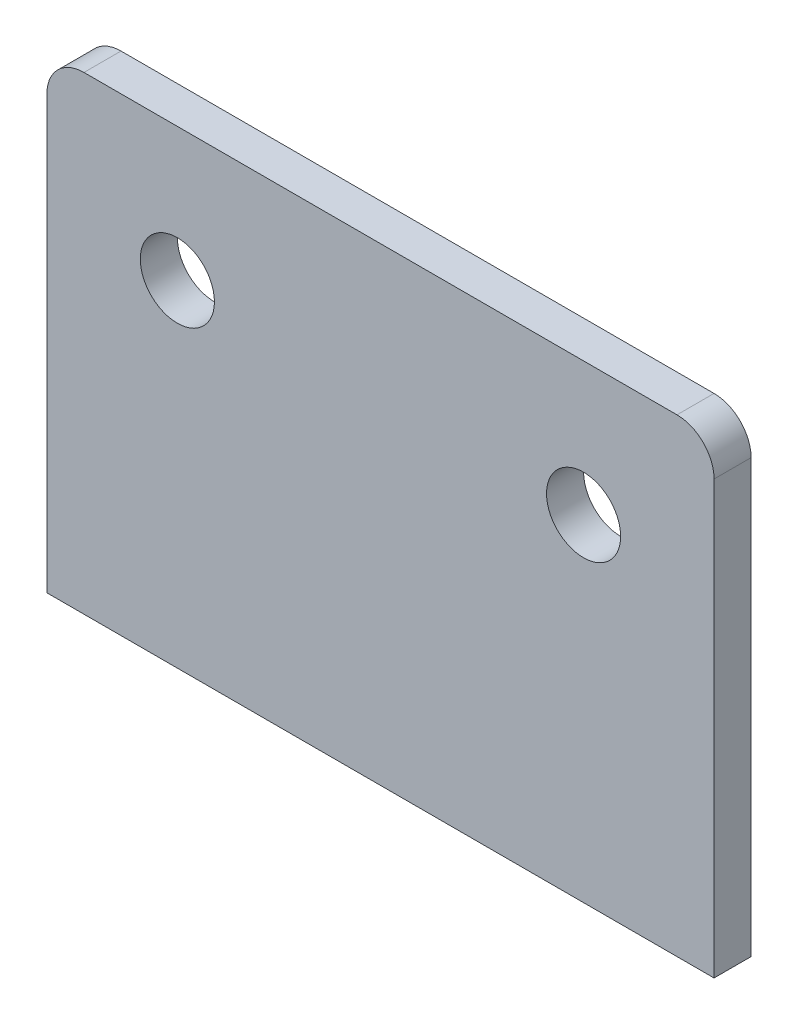
ISO-10303-21;
HEADER;
FILE_DESCRIPTION(('STEP AP214'),'2;1');
FILE_NAME('part.step','',(''),(''),'','','');
FILE_SCHEMA(('AUTOMOTIVE_DESIGN { 1 0 10303 214 1 1 1 1 }'));
ENDSEC;
DATA;
#1=APPLICATION_CONTEXT('core data for automotive mechanical design processes');
#2=APPLICATION_PROTOCOL_DEFINITION('international standard','automotive_design',2000,#1);
#3=PRODUCT_CONTEXT('',#1,'mechanical');
#4=PRODUCT('Part','Part','',(#3));
#5=PRODUCT_RELATED_PRODUCT_CATEGORY('part','',(#4));
#6=PRODUCT_DEFINITION_FORMATION('','',#4);
#7=PRODUCT_DEFINITION_CONTEXT('part definition',#1,'design');
#8=PRODUCT_DEFINITION('design','',#6,#7);
#9=PRODUCT_DEFINITION_SHAPE('','',#8);
#10=(LENGTH_UNIT() NAMED_UNIT(*) SI_UNIT(.MILLI.,.METRE.));
#11=(NAMED_UNIT(*) PLANE_ANGLE_UNIT() SI_UNIT($,.RADIAN.));
#12=(NAMED_UNIT(*) SI_UNIT($,.STERADIAN.) SOLID_ANGLE_UNIT());
#13=UNCERTAINTY_MEASURE_WITH_UNIT(LENGTH_MEASURE(1.E-05),#10,'distance_accuracy_value','');
#14=(GEOMETRIC_REPRESENTATION_CONTEXT(3) GLOBAL_UNCERTAINTY_ASSIGNED_CONTEXT((#13)) GLOBAL_UNIT_ASSIGNED_CONTEXT((#10,
#11,#12)) REPRESENTATION_CONTEXT('',''));
#15=CARTESIAN_POINT('',(0.,0.,0.));
#16=DIRECTION('',(0.,0.,1.));
#17=DIRECTION('',(1.,0.,0.));
#18=AXIS2_PLACEMENT_3D('',#15,#16,#17);
#19=CARTESIAN_POINT('',(-28.3289512231324,3.07077373787596,-3.175));
#20=DIRECTION('',(-1.,0.,0.));
#21=DIRECTION('',(0.,-1.,0.));
#22=AXIS2_PLACEMENT_3D('',#19,#20,#21);
#23=PLANE('',#22);
#24=DIRECTION('',(0.,0.,-1.));
#25=VECTOR('',#24,1.);
#26=CARTESIAN_POINT('',(-28.3289512231324,-33.946696309652,1.905));
#27=LINE('',#26,#25);
#28=CARTESIAN_POINT('',(-28.3289512231324,-33.946696309652,0.));
#29=VERTEX_POINT('',#28);
#30=CARTESIAN_POINT('',(-28.3289512231324,-33.946696309652,-3.175));
#31=VERTEX_POINT('',#30);
#32=EDGE_CURVE('E96',#29,#31,#27,.T.);
#33=ORIENTED_EDGE('',*,*,#32,.F.);
#34=DIRECTION('',(0.,-1.,0.));
#35=VECTOR('',#34,1.);
#36=CARTESIAN_POINT('',(-28.3289512231324,3.07077373787596,0.));
#37=LINE('',#36,#35);
#38=CARTESIAN_POINT('',(-28.3289512231324,3.07077373787596,0.));
#39=VERTEX_POINT('',#38);
#40=EDGE_CURVE('E106',#39,#29,#37,.T.);
#41=ORIENTED_EDGE('',*,*,#40,.F.);
#42=DIRECTION('',(0.,0.,1.));
#43=VECTOR('',#42,1.);
#44=CARTESIAN_POINT('',(-28.3289512231324,3.07077373787596,-3.175));
#45=LINE('',#44,#43);
#46=CARTESIAN_POINT('',(-28.3289512231324,3.07077373787596,-3.175));
#47=VERTEX_POINT('',#46);
#48=EDGE_CURVE('E43',#47,#39,#45,.T.);
#49=ORIENTED_EDGE('',*,*,#48,.F.);
#50=DIRECTION('',(0.,-1.,0.));
#51=VECTOR('',#50,1.);
#52=CARTESIAN_POINT('',(-28.3289512231324,-34.9224567040588,-3.175));
#53=LINE('',#52,#51);
#54=EDGE_CURVE('E58',#47,#31,#53,.T.);
#55=ORIENTED_EDGE('',*,*,#54,.T.);
#56=EDGE_LOOP('',(#33,#41,#49,#55));
#57=FACE_BOUND('',#56,.T.);
#58=ADVANCED_FACE('F35',(#57),#23,.T.);
#59=CARTESIAN_POINT('',(-25.1539512231324,3.07077373787597,-3.175));
#60=DIRECTION('',(0.,0.,1.));
#61=DIRECTION('',(1.,0.,0.));
#62=AXIS2_PLACEMENT_3D('',#59,#60,#61);
#63=CYLINDRICAL_SURFACE('',#62,3.175);
#64=CARTESIAN_POINT('',(-25.1539512231324,3.07077373787597,0.));
#65=DIRECTION('',(0.,0.,1.));
#66=DIRECTION('',(1.,0.,0.));
#67=AXIS2_PLACEMENT_3D('',#64,#65,#66);
#68=CIRCLE('',#67,3.175);
#69=CARTESIAN_POINT('',(-25.1539512231324,6.24577373787597,0.));
#70=VERTEX_POINT('',#69);
#71=EDGE_CURVE('E110',#70,#39,#68,.T.);
#72=ORIENTED_EDGE('',*,*,#71,.F.);
#73=DIRECTION('',(0.,0.,1.));
#74=VECTOR('',#73,1.);
#75=CARTESIAN_POINT('',(-25.1539512231324,6.24577373787597,-3.175));
#76=LINE('',#75,#74);
#77=CARTESIAN_POINT('',(-25.1539512231324,6.24577373787597,-3.175));
#78=VERTEX_POINT('',#77);
#79=EDGE_CURVE('E135',#78,#70,#76,.T.);
#80=ORIENTED_EDGE('',*,*,#79,.F.);
#81=CARTESIAN_POINT('',(-25.1539512231324,3.07077373787597,-3.175));
#82=DIRECTION('',(0.,0.,1.));
#83=DIRECTION('',(1.,0.,0.));
#84=AXIS2_PLACEMENT_3D('',#81,#82,#83);
#85=CIRCLE('',#84,3.175);
#86=EDGE_CURVE('E121',#78,#47,#85,.T.);
#87=ORIENTED_EDGE('',*,*,#86,.T.);
#88=ORIENTED_EDGE('',*,*,#48,.T.);
#89=EDGE_LOOP('',(#72,#80,#87,#88));
#90=FACE_BOUND('',#89,.T.);
#91=ADVANCED_FACE('F146',(#90),#63,.T.);
#92=CARTESIAN_POINT('',(-25.1539512231324,6.24577373787597,-3.175));
#93=DIRECTION('',(0.,1.,0.));
#94=DIRECTION('',(0.,0.,1.));
#95=AXIS2_PLACEMENT_3D('',#92,#93,#94);
#96=PLANE('',#95);
#97=DIRECTION('',(-1.,0.,0.));
#98=VECTOR('',#97,1.);
#99=CARTESIAN_POINT('',(-25.1539512231324,6.24577373787597,0.));
#100=LINE('',#99,#98);
#101=CARTESIAN_POINT('',(25.6460487768676,6.24577373787597,0.));
#102=VERTEX_POINT('',#101);
#103=EDGE_CURVE('E130',#102,#70,#100,.T.);
#104=ORIENTED_EDGE('',*,*,#103,.F.);
#105=DIRECTION('',(0.,0.,1.));
#106=VECTOR('',#105,1.);
#107=CARTESIAN_POINT('',(25.6460487768676,6.24577373787597,-3.175));
#108=LINE('',#107,#106);
#109=CARTESIAN_POINT('',(25.6460487768676,6.24577373787597,-3.175));
#110=VERTEX_POINT('',#109);
#111=EDGE_CURVE('E137',#110,#102,#108,.T.);
#112=ORIENTED_EDGE('',*,*,#111,.F.);
#113=DIRECTION('',(-1.,0.,0.));
#114=VECTOR('',#113,1.);
#115=CARTESIAN_POINT('',(-25.1539512231324,6.24577373787597,-3.175));
#116=LINE('',#115,#114);
#117=EDGE_CURVE('E118',#110,#78,#116,.T.);
#118=ORIENTED_EDGE('',*,*,#117,.T.);
#119=ORIENTED_EDGE('',*,*,#79,.T.);
#120=EDGE_LOOP('',(#104,#112,#118,#119));
#121=FACE_BOUND('',#120,.T.);
#122=ADVANCED_FACE('F149',(#121),#96,.T.);
#123=CARTESIAN_POINT('',(25.6460487768676,3.07077373787597,-3.175));
#124=DIRECTION('',(0.,0.,1.));
#125=DIRECTION('',(1.,0.,0.));
#126=AXIS2_PLACEMENT_3D('',#123,#124,#125);
#127=CYLINDRICAL_SURFACE('',#126,3.175);
#128=CARTESIAN_POINT('',(25.6460487768676,3.07077373787597,0.));
#129=DIRECTION('',(0.,0.,1.));
#130=DIRECTION('',(-1.,0.,0.));
#131=AXIS2_PLACEMENT_3D('',#128,#129,#130);
#132=CIRCLE('',#131,3.175);
#133=CARTESIAN_POINT('',(28.8210487768676,3.07077373787597,0.));
#134=VERTEX_POINT('',#133);
#135=EDGE_CURVE('E126',#134,#102,#132,.T.);
#136=ORIENTED_EDGE('',*,*,#135,.F.);
#137=DIRECTION('',(0.,0.,1.));
#138=VECTOR('',#137,1.);
#139=CARTESIAN_POINT('',(28.8210487768676,3.07077373787597,-3.175));
#140=LINE('',#139,#138);
#141=CARTESIAN_POINT('',(28.8210487768676,3.07077373787597,-3.175));
#142=VERTEX_POINT('',#141);
#143=EDGE_CURVE('E123',#142,#134,#140,.T.);
#144=ORIENTED_EDGE('',*,*,#143,.F.);
#145=CARTESIAN_POINT('',(25.6460487768676,3.07077373787597,-3.175));
#146=DIRECTION('',(0.,0.,1.));
#147=DIRECTION('',(-1.,0.,0.));
#148=AXIS2_PLACEMENT_3D('',#145,#146,#147);
#149=CIRCLE('',#148,3.175);
#150=EDGE_CURVE('E108',#142,#110,#149,.T.);
#151=ORIENTED_EDGE('',*,*,#150,.T.);
#152=ORIENTED_EDGE('',*,*,#111,.T.);
#153=EDGE_LOOP('',(#136,#144,#151,#152));
#154=FACE_BOUND('',#153,.T.);
#155=ADVANCED_FACE('F141',(#154),#127,.T.);
#156=CARTESIAN_POINT('',(28.8210487768676,-34.9224567040588,-3.175));
#157=DIRECTION('',(1.,0.,0.));
#158=DIRECTION('',(0.,0.,-1.));
#159=AXIS2_PLACEMENT_3D('',#156,#157,#158);
#160=PLANE('',#159);
#161=DIRECTION('',(0.,0.,-1.));
#162=VECTOR('',#161,1.);
#163=CARTESIAN_POINT('',(28.8210487768676,-33.946696309652,1.905));
#164=LINE('',#163,#162);
#165=CARTESIAN_POINT('',(28.8210487768676,-33.946696309652,0.));
#166=VERTEX_POINT('',#165);
#167=CARTESIAN_POINT('',(28.8210487768676,-33.946696309652,-3.175));
#168=VERTEX_POINT('',#167);
#169=EDGE_CURVE('E49',#166,#168,#164,.T.);
#170=ORIENTED_EDGE('',*,*,#169,.T.);
#171=DIRECTION('',(0.,1.,0.));
#172=VECTOR('',#171,1.);
#173=CARTESIAN_POINT('',(28.8210487768676,-34.9224567040588,-3.175));
#174=LINE('',#173,#172);
#175=EDGE_CURVE('E86',#168,#142,#174,.T.);
#176=ORIENTED_EDGE('',*,*,#175,.T.);
#177=ORIENTED_EDGE('',*,*,#143,.T.);
#178=DIRECTION('',(0.,1.,0.));
#179=VECTOR('',#178,1.);
#180=CARTESIAN_POINT('',(28.8210487768676,-34.9224567040588,0.));
#181=LINE('',#180,#179);
#182=EDGE_CURVE('E124',#166,#134,#181,.T.);
#183=ORIENTED_EDGE('',*,*,#182,.F.);
#184=EDGE_LOOP('',(#170,#176,#177,#183));
#185=FACE_BOUND('',#184,.T.);
#186=ADVANCED_FACE('F37',(#185),#160,.T.);
#187=CARTESIAN_POINT('',(-25.1539512231324,-57.1474567040588,-3.175));
#188=DIRECTION('',(0.,0.,1.));
#189=DIRECTION('',(1.,0.,0.));
#190=AXIS2_PLACEMENT_3D('',#187,#188,#189);
#191=PLANE('',#190);
#192=CARTESIAN_POINT('',(-17.1529512231324,-5.18422626212403,-3.175));
#193=DIRECTION('',(0.,0.,1.));
#194=DIRECTION('',(1.,0.,0.));
#195=AXIS2_PLACEMENT_3D('',#192,#193,#194);
#196=CIRCLE('',#195,3.175);
#197=CARTESIAN_POINT('',(-13.9779512231324,-5.18422626212403,-3.175));
#198=VERTEX_POINT('',#197);
#199=EDGE_CURVE('E127',#198,#198,#196,.T.);
#200=ORIENTED_EDGE('',*,*,#199,.T.);
#201=EDGE_LOOP('',(#200));
#202=FACE_BOUND('',#201,.T.);
#203=CARTESIAN_POINT('',(17.6450487768676,-5.18422626212403,-3.175));
#204=DIRECTION('',(0.,0.,1.));
#205=DIRECTION('',(-1.,0.,0.));
#206=AXIS2_PLACEMENT_3D('',#203,#204,#205);
#207=CIRCLE('',#206,3.175);
#208=CARTESIAN_POINT('',(14.4700487768676,-5.18422626212403,-3.175));
#209=VERTEX_POINT('',#208);
#210=EDGE_CURVE('E245',#209,#209,#207,.T.);
#211=ORIENTED_EDGE('',*,*,#210,.T.);
#212=EDGE_LOOP('',(#211));
#213=FACE_BOUND('',#212,.T.);
#214=ORIENTED_EDGE('',*,*,#175,.F.);
#215=DIRECTION('',(1.,0.,0.));
#216=VECTOR('',#215,1.);
#217=CARTESIAN_POINT('',(28.8210487768676,-33.946696309652,-3.175));
#218=LINE('',#217,#216);
#219=EDGE_CURVE('E98',#31,#168,#218,.T.);
#220=ORIENTED_EDGE('',*,*,#219,.F.);
#221=ORIENTED_EDGE('',*,*,#54,.F.);
#222=ORIENTED_EDGE('',*,*,#86,.F.);
#223=ORIENTED_EDGE('',*,*,#117,.F.);
#224=ORIENTED_EDGE('',*,*,#150,.F.);
#225=EDGE_LOOP('',(#214,#220,#221,#222,#223,#224));
#226=FACE_BOUND('',#225,.T.);
#227=ADVANCED_FACE('F103',(#202,#213,#226),#191,.F.);
#228=CARTESIAN_POINT('',(-25.1539512231324,-57.1474567040588,0.));
#229=DIRECTION('',(0.,0.,1.));
#230=DIRECTION('',(1.,0.,0.));
#231=AXIS2_PLACEMENT_3D('',#228,#229,#230);
#232=PLANE('',#231);
#233=DIRECTION('',(-1.,0.,0.));
#234=VECTOR('',#233,1.);
#235=CARTESIAN_POINT('',(-25.1539512231324,-33.946696309652,0.));
#236=LINE('',#235,#234);
#237=EDGE_CURVE('E11',#166,#29,#236,.T.);
#238=ORIENTED_EDGE('',*,*,#237,.F.);
#239=ORIENTED_EDGE('',*,*,#182,.T.);
#240=ORIENTED_EDGE('',*,*,#135,.T.);
#241=ORIENTED_EDGE('',*,*,#103,.T.);
#242=ORIENTED_EDGE('',*,*,#71,.T.);
#243=ORIENTED_EDGE('',*,*,#40,.T.);
#244=EDGE_LOOP('',(#238,#239,#240,#241,#242,#243));
#245=FACE_BOUND('',#244,.T.);
#246=CARTESIAN_POINT('',(-17.1529512231324,-5.18422626212403,0.));
#247=DIRECTION('',(0.,0.,1.));
#248=DIRECTION('',(1.,0.,0.));
#249=AXIS2_PLACEMENT_3D('',#246,#247,#248);
#250=CIRCLE('',#249,3.175);
#251=CARTESIAN_POINT('',(-13.9779512231324,-5.18422626212403,0.));
#252=VERTEX_POINT('',#251);
#253=EDGE_CURVE('E244',#252,#252,#250,.T.);
#254=ORIENTED_EDGE('',*,*,#253,.F.);
#255=EDGE_LOOP('',(#254));
#256=FACE_BOUND('',#255,.T.);
#257=CARTESIAN_POINT('',(17.6450487768676,-5.18422626212403,0.));
#258=DIRECTION('',(0.,0.,1.));
#259=DIRECTION('',(-1.,0.,0.));
#260=AXIS2_PLACEMENT_3D('',#257,#258,#259);
#261=CIRCLE('',#260,3.175);
#262=CARTESIAN_POINT('',(14.4700487768676,-5.18422626212403,0.));
#263=VERTEX_POINT('',#262);
#264=EDGE_CURVE('E113',#263,#263,#261,.T.);
#265=ORIENTED_EDGE('',*,*,#264,.F.);
#266=EDGE_LOOP('',(#265));
#267=FACE_BOUND('',#266,.T.);
#268=ADVANCED_FACE('F144',(#245,#256,#267),#232,.T.);
#269=CARTESIAN_POINT('',(17.6450487768676,-5.18422626212403,-3.175));
#270=DIRECTION('',(0.,0.,1.));
#271=DIRECTION('',(1.,0.,0.));
#272=AXIS2_PLACEMENT_3D('',#269,#270,#271);
#273=CYLINDRICAL_SURFACE('',#272,3.175);
#274=ORIENTED_EDGE('',*,*,#210,.F.);
#275=EDGE_LOOP('',(#274));
#276=FACE_BOUND('',#275,.T.);
#277=ORIENTED_EDGE('',*,*,#264,.T.);
#278=EDGE_LOOP('',(#277));
#279=FACE_BOUND('',#278,.T.);
#280=ADVANCED_FACE('F166',(#276,#279),#273,.F.);
#281=CARTESIAN_POINT('',(-17.1529512231324,-5.18422626212403,-3.175));
#282=DIRECTION('',(0.,0.,1.));
#283=DIRECTION('',(1.,0.,0.));
#284=AXIS2_PLACEMENT_3D('',#281,#282,#283);
#285=CYLINDRICAL_SURFACE('',#284,3.175);
#286=ORIENTED_EDGE('',*,*,#199,.F.);
#287=EDGE_LOOP('',(#286));
#288=FACE_BOUND('',#287,.T.);
#289=ORIENTED_EDGE('',*,*,#253,.T.);
#290=EDGE_LOOP('',(#289));
#291=FACE_BOUND('',#290,.T.);
#292=ADVANCED_FACE('F172',(#288,#291),#285,.F.);
#293=CARTESIAN_POINT('',(28.8210487768676,-33.946696309652,1.905));
#294=DIRECTION('',(0.,1.,0.));
#295=DIRECTION('',(0.,0.,1.));
#296=AXIS2_PLACEMENT_3D('',#293,#294,#295);
#297=PLANE('',#296);
#298=ORIENTED_EDGE('',*,*,#237,.T.);
#299=ORIENTED_EDGE('',*,*,#32,.T.);
#300=ORIENTED_EDGE('',*,*,#219,.T.);
#301=ORIENTED_EDGE('',*,*,#169,.F.);
#302=EDGE_LOOP('',(#298,#299,#300,#301));
#303=FACE_BOUND('',#302,.T.);
#304=ADVANCED_FACE('F97',(#303),#297,.F.);
#305=CLOSED_SHELL('',(#58,#91,#122,#155,#186,#227,#268,#280,#292,#304));
#306=MANIFOLD_SOLID_BREP('B2',#305);
#307=ADVANCED_BREP_SHAPE_REPRESENTATION('',(#18,#306),#14);
#308=SHAPE_DEFINITION_REPRESENTATION(#9,#307);
ENDSEC;
END-ISO-10303-21;
